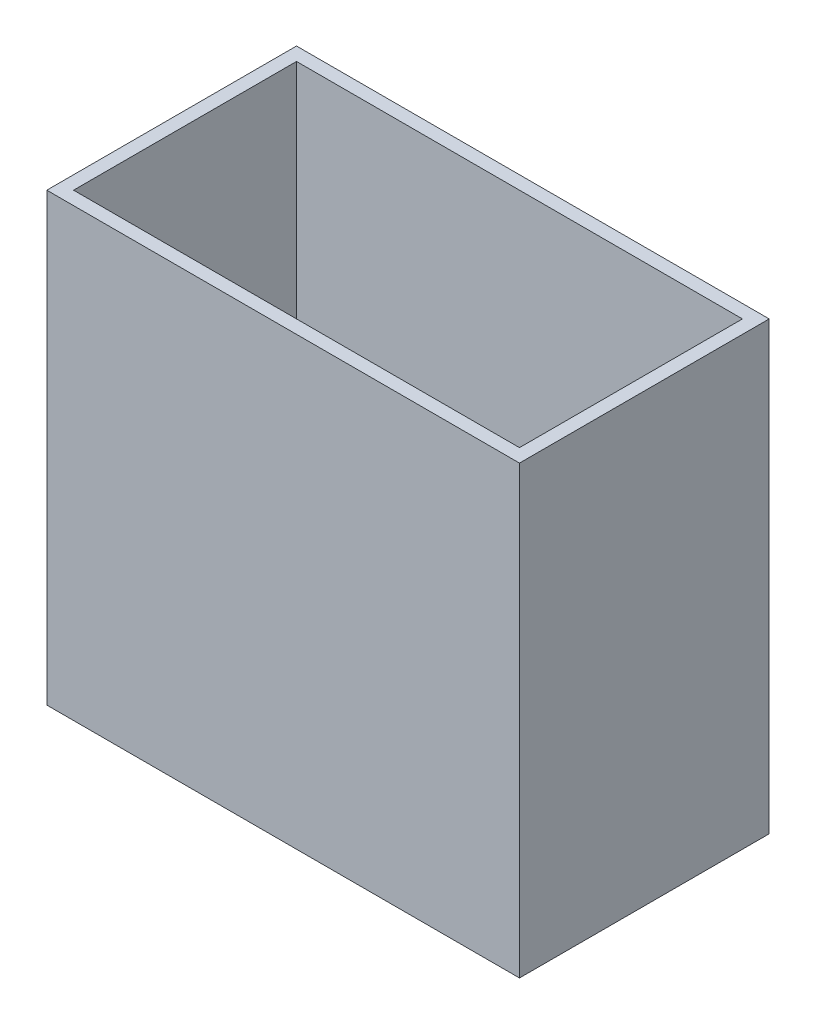
ISO-10303-21;
HEADER;
FILE_DESCRIPTION(('STEP AP214'),'2;1');
FILE_NAME('part.step','',(''),(''),'','','');
FILE_SCHEMA(('AUTOMOTIVE_DESIGN { 1 0 10303 214 1 1 1 1 }'));
ENDSEC;
DATA;
#1=APPLICATION_CONTEXT('core data for automotive mechanical design processes');
#2=APPLICATION_PROTOCOL_DEFINITION('international standard','automotive_design',2000,#1);
#3=PRODUCT_CONTEXT('',#1,'mechanical');
#4=PRODUCT('Part','Part','',(#3));
#5=PRODUCT_RELATED_PRODUCT_CATEGORY('part','',(#4));
#6=PRODUCT_DEFINITION_FORMATION('','',#4);
#7=PRODUCT_DEFINITION_CONTEXT('part definition',#1,'design');
#8=PRODUCT_DEFINITION('design','',#6,#7);
#9=PRODUCT_DEFINITION_SHAPE('','',#8);
#10=(LENGTH_UNIT() NAMED_UNIT(*) SI_UNIT(.MILLI.,.METRE.));
#11=(NAMED_UNIT(*) PLANE_ANGLE_UNIT() SI_UNIT($,.RADIAN.));
#12=(NAMED_UNIT(*) SI_UNIT($,.STERADIAN.) SOLID_ANGLE_UNIT());
#13=UNCERTAINTY_MEASURE_WITH_UNIT(LENGTH_MEASURE(1.E-05),#10,'distance_accuracy_value','');
#14=(GEOMETRIC_REPRESENTATION_CONTEXT(3) GLOBAL_UNCERTAINTY_ASSIGNED_CONTEXT((#13)) GLOBAL_UNIT_ASSIGNED_CONTEXT((#10,
#11,#12)) REPRESENTATION_CONTEXT('',''));
#15=CARTESIAN_POINT('',(0.,0.,0.));
#16=DIRECTION('',(0.,0.,1.));
#17=DIRECTION('',(1.,0.,0.));
#18=AXIS2_PLACEMENT_3D('',#15,#16,#17);
#19=CARTESIAN_POINT('',(0.,100.,0.));
#20=DIRECTION('',(0.,-1.,0.));
#21=DIRECTION('',(0.,0.,-1.));
#22=AXIS2_PLACEMENT_3D('',#19,#20,#21);
#23=PLANE('',#22);
#24=DIRECTION('',(0.,0.,1.));
#25=VECTOR('',#24,1.);
#26=CARTESIAN_POINT('',(0.,100.,0.));
#27=LINE('',#26,#25);
#28=CARTESIAN_POINT('',(0.,100.,-56.));
#29=VERTEX_POINT('',#28);
#30=CARTESIAN_POINT('',(0.,100.,0.));
#31=VERTEX_POINT('',#30);
#32=EDGE_CURVE('E140',#29,#31,#27,.T.);
#33=ORIENTED_EDGE('',*,*,#32,.T.);
#34=DIRECTION('',(1.,0.,0.));
#35=VECTOR('',#34,1.);
#36=CARTESIAN_POINT('',(0.,100.,0.));
#37=LINE('',#36,#35);
#38=CARTESIAN_POINT('',(106.,100.,0.));
#39=VERTEX_POINT('',#38);
#40=EDGE_CURVE('E143',#31,#39,#37,.T.);
#41=ORIENTED_EDGE('',*,*,#40,.T.);
#42=DIRECTION('',(0.,0.,-1.));
#43=VECTOR('',#42,1.);
#44=CARTESIAN_POINT('',(106.,100.,0.));
#45=LINE('',#44,#43);
#46=CARTESIAN_POINT('',(106.,100.,-56.));
#47=VERTEX_POINT('',#46);
#48=EDGE_CURVE('E146',#39,#47,#45,.T.);
#49=ORIENTED_EDGE('',*,*,#48,.T.);
#50=DIRECTION('',(-1.,0.,0.));
#51=VECTOR('',#50,1.);
#52=CARTESIAN_POINT('',(0.,100.,-56.));
#53=LINE('',#52,#51);
#54=EDGE_CURVE('E148',#47,#29,#53,.T.);
#55=ORIENTED_EDGE('',*,*,#54,.T.);
#56=EDGE_LOOP('',(#33,#41,#49,#55));
#57=FACE_BOUND('',#56,.T.);
#58=DIRECTION('',(1.,0.,0.));
#59=VECTOR('',#58,1.);
#60=CARTESIAN_POINT('',(3.,100.,-3.));
#61=LINE('',#60,#59);
#62=CARTESIAN_POINT('',(3.,100.,-3.));
#63=VERTEX_POINT('',#62);
#64=CARTESIAN_POINT('',(103.,100.,-3.));
#65=VERTEX_POINT('',#64);
#66=EDGE_CURVE('E104',#63,#65,#61,.T.);
#67=ORIENTED_EDGE('',*,*,#66,.F.);
#68=DIRECTION('',(0.,0.,1.));
#69=VECTOR('',#68,1.);
#70=CARTESIAN_POINT('',(3.,100.,-3.));
#71=LINE('',#70,#69);
#72=CARTESIAN_POINT('',(3.,100.,-53.));
#73=VERTEX_POINT('',#72);
#74=EDGE_CURVE('E126',#73,#63,#71,.T.);
#75=ORIENTED_EDGE('',*,*,#74,.F.);
#76=DIRECTION('',(-1.,0.,0.));
#77=VECTOR('',#76,1.);
#78=CARTESIAN_POINT('',(3.,100.,-53.));
#79=LINE('',#78,#77);
#80=CARTESIAN_POINT('',(103.,100.,-53.));
#81=VERTEX_POINT('',#80);
#82=EDGE_CURVE('E124',#81,#73,#79,.T.);
#83=ORIENTED_EDGE('',*,*,#82,.F.);
#84=DIRECTION('',(0.,0.,-1.));
#85=VECTOR('',#84,1.);
#86=CARTESIAN_POINT('',(103.,100.,-3.));
#87=LINE('',#86,#85);
#88=EDGE_CURVE('E112',#65,#81,#87,.T.);
#89=ORIENTED_EDGE('',*,*,#88,.F.);
#90=EDGE_LOOP('',(#67,#75,#83,#89));
#91=FACE_BOUND('',#90,.T.);
#92=ADVANCED_FACE('F39',(#57,#91),#23,.F.);
#93=CARTESIAN_POINT('',(0.,0.,0.));
#94=DIRECTION('',(0.,-1.,0.));
#95=DIRECTION('',(0.,0.,-1.));
#96=AXIS2_PLACEMENT_3D('',#93,#94,#95);
#97=PLANE('',#96);
#98=DIRECTION('',(0.,0.,1.));
#99=VECTOR('',#98,1.);
#100=CARTESIAN_POINT('',(0.,0.,0.));
#101=LINE('',#100,#99);
#102=CARTESIAN_POINT('',(0.,0.,-56.));
#103=VERTEX_POINT('',#102);
#104=CARTESIAN_POINT('',(0.,0.,0.));
#105=VERTEX_POINT('',#104);
#106=EDGE_CURVE('E120',#103,#105,#101,.T.);
#107=ORIENTED_EDGE('',*,*,#106,.F.);
#108=DIRECTION('',(-1.,0.,0.));
#109=VECTOR('',#108,1.);
#110=CARTESIAN_POINT('',(0.,0.,-56.));
#111=LINE('',#110,#109);
#112=CARTESIAN_POINT('',(106.,0.,-56.));
#113=VERTEX_POINT('',#112);
#114=EDGE_CURVE('E144',#113,#103,#111,.T.);
#115=ORIENTED_EDGE('',*,*,#114,.F.);
#116=DIRECTION('',(0.,0.,-1.));
#117=VECTOR('',#116,1.);
#118=CARTESIAN_POINT('',(106.,0.,0.));
#119=LINE('',#118,#117);
#120=CARTESIAN_POINT('',(106.,0.,0.));
#121=VERTEX_POINT('',#120);
#122=EDGE_CURVE('E155',#121,#113,#119,.T.);
#123=ORIENTED_EDGE('',*,*,#122,.F.);
#124=DIRECTION('',(1.,0.,0.));
#125=VECTOR('',#124,1.);
#126=CARTESIAN_POINT('',(0.,0.,0.));
#127=LINE('',#126,#125);
#128=EDGE_CURVE('E153',#105,#121,#127,.T.);
#129=ORIENTED_EDGE('',*,*,#128,.F.);
#130=EDGE_LOOP('',(#107,#115,#123,#129));
#131=FACE_BOUND('',#130,.T.);
#132=DIRECTION('',(0.,0.,1.));
#133=VECTOR('',#132,1.);
#134=CARTESIAN_POINT('',(3.,0.,-3.));
#135=LINE('',#134,#133);
#136=CARTESIAN_POINT('',(3.,0.,-53.));
#137=VERTEX_POINT('',#136);
#138=CARTESIAN_POINT('',(3.,0.,-3.));
#139=VERTEX_POINT('',#138);
#140=EDGE_CURVE('E113',#137,#139,#135,.T.);
#141=ORIENTED_EDGE('',*,*,#140,.T.);
#142=DIRECTION('',(1.,0.,0.));
#143=VECTOR('',#142,1.);
#144=CARTESIAN_POINT('',(3.,0.,-3.));
#145=LINE('',#144,#143);
#146=CARTESIAN_POINT('',(103.,0.,-3.));
#147=VERTEX_POINT('',#146);
#148=EDGE_CURVE('E62',#139,#147,#145,.T.);
#149=ORIENTED_EDGE('',*,*,#148,.T.);
#150=DIRECTION('',(0.,0.,-1.));
#151=VECTOR('',#150,1.);
#152=CARTESIAN_POINT('',(103.,0.,-3.));
#153=LINE('',#152,#151);
#154=CARTESIAN_POINT('',(103.,0.,-53.));
#155=VERTEX_POINT('',#154);
#156=EDGE_CURVE('E119',#147,#155,#153,.T.);
#157=ORIENTED_EDGE('',*,*,#156,.T.);
#158=DIRECTION('',(-1.,0.,0.));
#159=VECTOR('',#158,1.);
#160=CARTESIAN_POINT('',(3.,0.,-53.));
#161=LINE('',#160,#159);
#162=EDGE_CURVE('E132',#155,#137,#161,.T.);
#163=ORIENTED_EDGE('',*,*,#162,.T.);
#164=EDGE_LOOP('',(#141,#149,#157,#163));
#165=FACE_BOUND('',#164,.T.);
#166=ADVANCED_FACE('F173',(#131,#165),#97,.T.);
#167=CARTESIAN_POINT('',(0.,100.,0.));
#168=DIRECTION('',(1.,0.,0.));
#169=DIRECTION('',(0.,0.,-1.));
#170=AXIS2_PLACEMENT_3D('',#167,#168,#169);
#171=PLANE('',#170);
#172=ORIENTED_EDGE('',*,*,#106,.T.);
#173=DIRECTION('',(0.,-1.,0.));
#174=VECTOR('',#173,1.);
#175=CARTESIAN_POINT('',(0.,100.,0.));
#176=LINE('',#175,#174);
#177=EDGE_CURVE('E11',#31,#105,#176,.T.);
#178=ORIENTED_EDGE('',*,*,#177,.F.);
#179=ORIENTED_EDGE('',*,*,#32,.F.);
#180=DIRECTION('',(0.,-1.,0.));
#181=VECTOR('',#180,1.);
#182=CARTESIAN_POINT('',(0.,100.,-56.));
#183=LINE('',#182,#181);
#184=EDGE_CURVE('E150',#29,#103,#183,.T.);
#185=ORIENTED_EDGE('',*,*,#184,.T.);
#186=EDGE_LOOP('',(#172,#178,#179,#185));
#187=FACE_BOUND('',#186,.T.);
#188=ADVANCED_FACE('F41',(#187),#171,.F.);
#189=CARTESIAN_POINT('',(0.,100.,0.));
#190=DIRECTION('',(0.,0.,-1.));
#191=DIRECTION('',(-1.,0.,0.));
#192=AXIS2_PLACEMENT_3D('',#189,#190,#191);
#193=PLANE('',#192);
#194=ORIENTED_EDGE('',*,*,#128,.T.);
#195=DIRECTION('',(0.,-1.,0.));
#196=VECTOR('',#195,1.);
#197=CARTESIAN_POINT('',(106.,100.,0.));
#198=LINE('',#197,#196);
#199=EDGE_CURVE('E47',#39,#121,#198,.T.);
#200=ORIENTED_EDGE('',*,*,#199,.F.);
#201=ORIENTED_EDGE('',*,*,#40,.F.);
#202=ORIENTED_EDGE('',*,*,#177,.T.);
#203=EDGE_LOOP('',(#194,#200,#201,#202));
#204=FACE_BOUND('',#203,.T.);
#205=ADVANCED_FACE('F183',(#204),#193,.F.);
#206=CARTESIAN_POINT('',(106.,100.,0.));
#207=DIRECTION('',(-1.,0.,0.));
#208=DIRECTION('',(0.,0.,1.));
#209=AXIS2_PLACEMENT_3D('',#206,#207,#208);
#210=PLANE('',#209);
#211=ORIENTED_EDGE('',*,*,#122,.T.);
#212=DIRECTION('',(0.,-1.,0.));
#213=VECTOR('',#212,1.);
#214=CARTESIAN_POINT('',(106.,100.,-56.));
#215=LINE('',#214,#213);
#216=EDGE_CURVE('E160',#47,#113,#215,.T.);
#217=ORIENTED_EDGE('',*,*,#216,.F.);
#218=ORIENTED_EDGE('',*,*,#48,.F.);
#219=ORIENTED_EDGE('',*,*,#199,.T.);
#220=EDGE_LOOP('',(#211,#217,#218,#219));
#221=FACE_BOUND('',#220,.T.);
#222=ADVANCED_FACE('F167',(#221),#210,.F.);
#223=CARTESIAN_POINT('',(0.,100.,-56.));
#224=DIRECTION('',(0.,0.,1.));
#225=DIRECTION('',(1.,0.,0.));
#226=AXIS2_PLACEMENT_3D('',#223,#224,#225);
#227=PLANE('',#226);
#228=ORIENTED_EDGE('',*,*,#114,.T.);
#229=ORIENTED_EDGE('',*,*,#184,.F.);
#230=ORIENTED_EDGE('',*,*,#54,.F.);
#231=ORIENTED_EDGE('',*,*,#216,.T.);
#232=EDGE_LOOP('',(#228,#229,#230,#231));
#233=FACE_BOUND('',#232,.T.);
#234=ADVANCED_FACE('F177',(#233),#227,.F.);
#235=CARTESIAN_POINT('',(3.,100.,-3.));
#236=DIRECTION('',(0.,0.,-1.));
#237=DIRECTION('',(-1.,0.,0.));
#238=AXIS2_PLACEMENT_3D('',#235,#236,#237);
#239=PLANE('',#238);
#240=ORIENTED_EDGE('',*,*,#148,.F.);
#241=DIRECTION('',(0.,-1.,0.));
#242=VECTOR('',#241,1.);
#243=CARTESIAN_POINT('',(3.,100.,-3.));
#244=LINE('',#243,#242);
#245=EDGE_CURVE('E108',#63,#139,#244,.T.);
#246=ORIENTED_EDGE('',*,*,#245,.F.);
#247=ORIENTED_EDGE('',*,*,#66,.T.);
#248=DIRECTION('',(0.,-1.,0.));
#249=VECTOR('',#248,1.);
#250=CARTESIAN_POINT('',(103.,100.,-3.));
#251=LINE('',#250,#249);
#252=EDGE_CURVE('E107',#65,#147,#251,.T.);
#253=ORIENTED_EDGE('',*,*,#252,.T.);
#254=EDGE_LOOP('',(#240,#246,#247,#253));
#255=FACE_BOUND('',#254,.T.);
#256=ADVANCED_FACE('F106',(#255),#239,.T.);
#257=CARTESIAN_POINT('',(103.,100.,-3.));
#258=DIRECTION('',(-1.,0.,0.));
#259=DIRECTION('',(0.,0.,1.));
#260=AXIS2_PLACEMENT_3D('',#257,#258,#259);
#261=PLANE('',#260);
#262=ORIENTED_EDGE('',*,*,#156,.F.);
#263=ORIENTED_EDGE('',*,*,#252,.F.);
#264=ORIENTED_EDGE('',*,*,#88,.T.);
#265=DIRECTION('',(0.,-1.,0.));
#266=VECTOR('',#265,1.);
#267=CARTESIAN_POINT('',(103.,100.,-53.));
#268=LINE('',#267,#266);
#269=EDGE_CURVE('E121',#81,#155,#268,.T.);
#270=ORIENTED_EDGE('',*,*,#269,.T.);
#271=EDGE_LOOP('',(#262,#263,#264,#270));
#272=FACE_BOUND('',#271,.T.);
#273=ADVANCED_FACE('F116',(#272),#261,.T.);
#274=CARTESIAN_POINT('',(3.,100.,-53.));
#275=DIRECTION('',(0.,0.,1.));
#276=DIRECTION('',(1.,0.,0.));
#277=AXIS2_PLACEMENT_3D('',#274,#275,#276);
#278=PLANE('',#277);
#279=ORIENTED_EDGE('',*,*,#162,.F.);
#280=ORIENTED_EDGE('',*,*,#269,.F.);
#281=ORIENTED_EDGE('',*,*,#82,.T.);
#282=DIRECTION('',(0.,-1.,0.));
#283=VECTOR('',#282,1.);
#284=CARTESIAN_POINT('',(3.,100.,-53.));
#285=LINE('',#284,#283);
#286=EDGE_CURVE('E54',#73,#137,#285,.T.);
#287=ORIENTED_EDGE('',*,*,#286,.T.);
#288=EDGE_LOOP('',(#279,#280,#281,#287));
#289=FACE_BOUND('',#288,.T.);
#290=ADVANCED_FACE('F206',(#289),#278,.T.);
#291=CARTESIAN_POINT('',(3.,100.,-3.));
#292=DIRECTION('',(1.,0.,0.));
#293=DIRECTION('',(0.,0.,-1.));
#294=AXIS2_PLACEMENT_3D('',#291,#292,#293);
#295=PLANE('',#294);
#296=ORIENTED_EDGE('',*,*,#140,.F.);
#297=ORIENTED_EDGE('',*,*,#286,.F.);
#298=ORIENTED_EDGE('',*,*,#74,.T.);
#299=ORIENTED_EDGE('',*,*,#245,.T.);
#300=EDGE_LOOP('',(#296,#297,#298,#299));
#301=FACE_BOUND('',#300,.T.);
#302=ADVANCED_FACE('F210',(#301),#295,.T.);
#303=CLOSED_SHELL('',(#92,#166,#188,#205,#222,#234,#256,#273,#290,#302));
#304=MANIFOLD_SOLID_BREP('B2',#303);
#305=ADVANCED_BREP_SHAPE_REPRESENTATION('',(#18,#304),#14);
#306=SHAPE_DEFINITION_REPRESENTATION(#9,#305);
ENDSEC;
END-ISO-10303-21;
